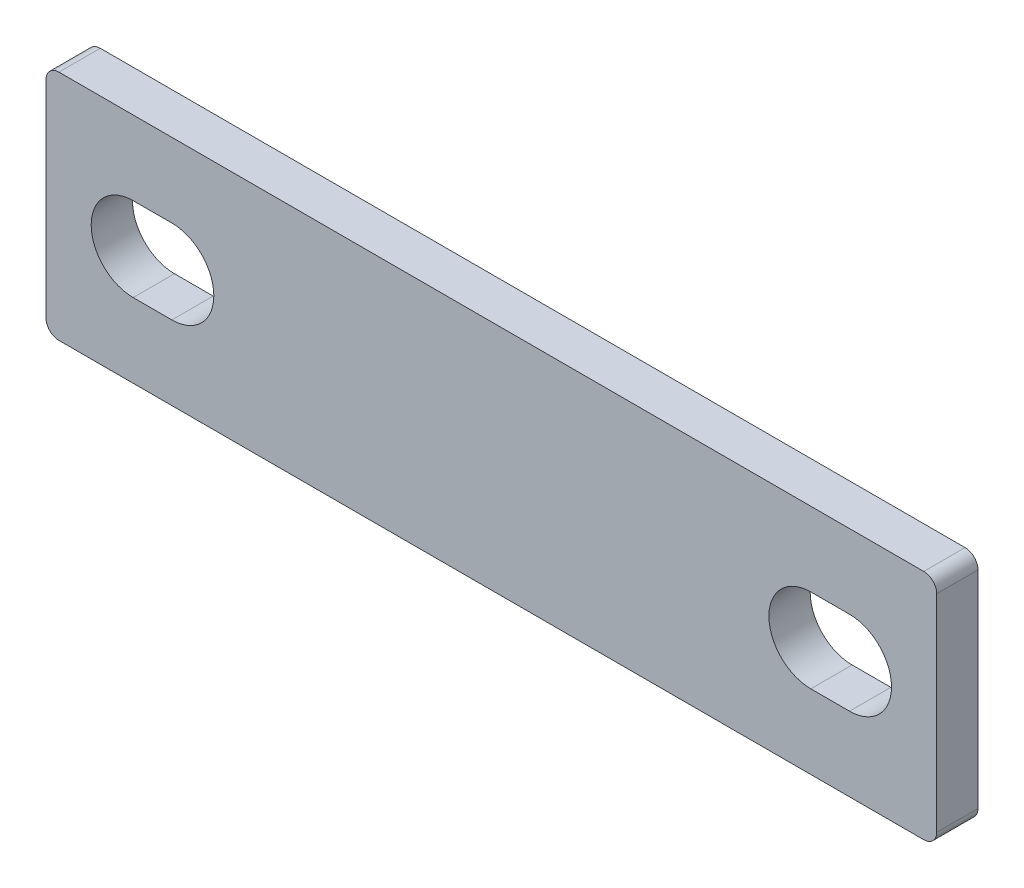
ISO-10303-21;
HEADER;
FILE_DESCRIPTION(('STEP AP214'),'2;1');
FILE_NAME('part.step','',(''),(''),'','','');
FILE_SCHEMA(('AUTOMOTIVE_DESIGN { 1 0 10303 214 1 1 1 1 }'));
ENDSEC;
DATA;
#1=APPLICATION_CONTEXT('core data for automotive mechanical design processes');
#2=APPLICATION_PROTOCOL_DEFINITION('international standard','automotive_design',2000,#1);
#3=PRODUCT_CONTEXT('',#1,'mechanical');
#4=PRODUCT('Part','Part','',(#3));
#5=PRODUCT_RELATED_PRODUCT_CATEGORY('part','',(#4));
#6=PRODUCT_DEFINITION_FORMATION('','',#4);
#7=PRODUCT_DEFINITION_CONTEXT('part definition',#1,'design');
#8=PRODUCT_DEFINITION('design','',#6,#7);
#9=PRODUCT_DEFINITION_SHAPE('','',#8);
#10=(LENGTH_UNIT() NAMED_UNIT(*) SI_UNIT(.MILLI.,.METRE.));
#11=(NAMED_UNIT(*) PLANE_ANGLE_UNIT() SI_UNIT($,.RADIAN.));
#12=(NAMED_UNIT(*) SI_UNIT($,.STERADIAN.) SOLID_ANGLE_UNIT());
#13=UNCERTAINTY_MEASURE_WITH_UNIT(LENGTH_MEASURE(1.E-05),#10,'distance_accuracy_value','');
#14=(GEOMETRIC_REPRESENTATION_CONTEXT(3) GLOBAL_UNCERTAINTY_ASSIGNED_CONTEXT((#13)) GLOBAL_UNIT_ASSIGNED_CONTEXT((#10,
#11,#12)) REPRESENTATION_CONTEXT('',''));
#15=CARTESIAN_POINT('',(0.,0.,0.));
#16=DIRECTION('',(0.,0.,1.));
#17=DIRECTION('',(1.,0.,0.));
#18=AXIS2_PLACEMENT_3D('',#15,#16,#17);
#19=CARTESIAN_POINT('',(-40.,-36.,149.018371888057));
#20=DIRECTION('',(0.,1.,0.));
#21=DIRECTION('',(0.,0.,1.));
#22=AXIS2_PLACEMENT_3D('',#19,#20,#21);
#23=PLANE('',#22);
#24=DIRECTION('',(1.,0.,0.));
#25=VECTOR('',#24,1.);
#26=CARTESIAN_POINT('',(-40.,-36.,6.40000000000004));
#27=LINE('',#26,#25);
#28=CARTESIAN_POINT('',(-136.,-36.,6.40000000000004));
#29=VERTEX_POINT('',#28);
#30=CARTESIAN_POINT('',(-2.,-36.,6.40000000000005));
#31=VERTEX_POINT('',#30);
#32=EDGE_CURVE('E305',#29,#31,#27,.T.);
#33=ORIENTED_EDGE('',*,*,#32,.F.);
#34=DIRECTION('',(0.,0.,-1.));
#35=VECTOR('',#34,1.);
#36=CARTESIAN_POINT('',(-136.,-36.,149.018371888057));
#37=LINE('',#36,#35);
#38=CARTESIAN_POINT('',(-136.,-36.,0.));
#39=VERTEX_POINT('',#38);
#40=EDGE_CURVE('E47',#29,#39,#37,.T.);
#41=ORIENTED_EDGE('',*,*,#40,.T.);
#42=DIRECTION('',(1.,0.,0.));
#43=VECTOR('',#42,1.);
#44=CARTESIAN_POINT('',(-40.,-36.,0.));
#45=LINE('',#44,#43);
#46=CARTESIAN_POINT('',(-2.,-36.,0.));
#47=VERTEX_POINT('',#46);
#48=EDGE_CURVE('E213',#39,#47,#45,.T.);
#49=ORIENTED_EDGE('',*,*,#48,.T.);
#50=DIRECTION('',(0.,0.,-1.));
#51=VECTOR('',#50,1.);
#52=CARTESIAN_POINT('',(-2.,-36.,149.018371888057));
#53=LINE('',#52,#51);
#54=EDGE_CURVE('E216',#31,#47,#53,.T.);
#55=ORIENTED_EDGE('',*,*,#54,.F.);
#56=EDGE_LOOP('',(#33,#41,#49,#55));
#57=FACE_BOUND('',#56,.T.);
#58=ADVANCED_FACE('F32',(#57),#23,.F.);
#59=CARTESIAN_POINT('',(-136.,-34.,149.018371888057));
#60=DIRECTION('',(0.,0.,-1.));
#61=DIRECTION('',(-1.,0.,0.));
#62=AXIS2_PLACEMENT_3D('',#59,#60,#61);
#63=CYLINDRICAL_SURFACE('',#62,2.);
#64=CARTESIAN_POINT('',(-136.,-34.,6.40000000000004));
#65=DIRECTION('',(0.,0.,1.));
#66=DIRECTION('',(0.,-1.,0.));
#67=AXIS2_PLACEMENT_3D('',#64,#65,#66);
#68=CIRCLE('',#67,2.);
#69=CARTESIAN_POINT('',(-138.,-34.,6.40000000000004));
#70=VERTEX_POINT('',#69);
#71=EDGE_CURVE('E253',#70,#29,#68,.T.);
#72=ORIENTED_EDGE('',*,*,#71,.F.);
#73=DIRECTION('',(0.,0.,-1.));
#74=VECTOR('',#73,1.);
#75=CARTESIAN_POINT('',(-138.,-34.,149.018371888057));
#76=LINE('',#75,#74);
#77=CARTESIAN_POINT('',(-138.,-34.,0.));
#78=VERTEX_POINT('',#77);
#79=EDGE_CURVE('E219',#70,#78,#76,.T.);
#80=ORIENTED_EDGE('',*,*,#79,.T.);
#81=CARTESIAN_POINT('',(-136.,-34.,0.));
#82=DIRECTION('',(0.,0.,1.));
#83=DIRECTION('',(1.,0.,0.));
#84=AXIS2_PLACEMENT_3D('',#81,#82,#83);
#85=CIRCLE('',#84,2.);
#86=EDGE_CURVE('E211',#78,#39,#85,.T.);
#87=ORIENTED_EDGE('',*,*,#86,.T.);
#88=ORIENTED_EDGE('',*,*,#40,.F.);
#89=EDGE_LOOP('',(#72,#80,#87,#88));
#90=FACE_BOUND('',#89,.T.);
#91=ADVANCED_FACE('F250',(#90),#63,.T.);
#92=CARTESIAN_POINT('',(-138.,-2.,149.018371888057));
#93=DIRECTION('',(1.,0.,0.));
#94=DIRECTION('',(0.,0.,-1.));
#95=AXIS2_PLACEMENT_3D('',#92,#93,#94);
#96=PLANE('',#95);
#97=DIRECTION('',(0.,-1.,0.));
#98=VECTOR('',#97,1.);
#99=CARTESIAN_POINT('',(-138.,-1.99999999999998,6.40000000000004));
#100=LINE('',#99,#98);
#101=CARTESIAN_POINT('',(-138.,-2.,6.40000000000004));
#102=VERTEX_POINT('',#101);
#103=EDGE_CURVE('E308',#102,#70,#100,.T.);
#104=ORIENTED_EDGE('',*,*,#103,.F.);
#105=DIRECTION('',(0.,0.,-1.));
#106=VECTOR('',#105,1.);
#107=CARTESIAN_POINT('',(-138.,-2.,149.018371888057));
#108=LINE('',#107,#106);
#109=CARTESIAN_POINT('',(-138.,-2.,0.));
#110=VERTEX_POINT('',#109);
#111=EDGE_CURVE('E221',#102,#110,#108,.T.);
#112=ORIENTED_EDGE('',*,*,#111,.T.);
#113=DIRECTION('',(0.,-1.,0.));
#114=VECTOR('',#113,1.);
#115=CARTESIAN_POINT('',(-138.,-2.,0.));
#116=LINE('',#115,#114);
#117=EDGE_CURVE('E208',#110,#78,#116,.T.);
#118=ORIENTED_EDGE('',*,*,#117,.T.);
#119=ORIENTED_EDGE('',*,*,#79,.F.);
#120=EDGE_LOOP('',(#104,#112,#118,#119));
#121=FACE_BOUND('',#120,.T.);
#122=ADVANCED_FACE('F256',(#121),#96,.F.);
#123=CARTESIAN_POINT('',(-136.,-2.,149.018371888057));
#124=DIRECTION('',(0.,0.,-1.));
#125=DIRECTION('',(-1.,0.,0.));
#126=AXIS2_PLACEMENT_3D('',#123,#124,#125);
#127=CYLINDRICAL_SURFACE('',#126,2.);
#128=CARTESIAN_POINT('',(-136.,-2.,6.40000000000004));
#129=DIRECTION('',(0.,0.,1.));
#130=DIRECTION('',(0.,-1.,0.));
#131=AXIS2_PLACEMENT_3D('',#128,#129,#130);
#132=CIRCLE('',#131,2.);
#133=CARTESIAN_POINT('',(-136.,0.,6.40000000000004));
#134=VERTEX_POINT('',#133);
#135=EDGE_CURVE('E263',#134,#102,#132,.T.);
#136=ORIENTED_EDGE('',*,*,#135,.F.);
#137=DIRECTION('',(0.,0.,-1.));
#138=VECTOR('',#137,1.);
#139=CARTESIAN_POINT('',(-136.,0.,149.018371888057));
#140=LINE('',#139,#138);
#141=CARTESIAN_POINT('',(-136.,0.,0.));
#142=VERTEX_POINT('',#141);
#143=EDGE_CURVE('E223',#134,#142,#140,.T.);
#144=ORIENTED_EDGE('',*,*,#143,.T.);
#145=CARTESIAN_POINT('',(-136.,-2.,0.));
#146=DIRECTION('',(0.,0.,1.));
#147=DIRECTION('',(1.,0.,0.));
#148=AXIS2_PLACEMENT_3D('',#145,#146,#147);
#149=CIRCLE('',#148,2.);
#150=EDGE_CURVE('E205',#142,#110,#149,.T.);
#151=ORIENTED_EDGE('',*,*,#150,.T.);
#152=ORIENTED_EDGE('',*,*,#111,.F.);
#153=EDGE_LOOP('',(#136,#144,#151,#152));
#154=FACE_BOUND('',#153,.T.);
#155=ADVANCED_FACE('F260',(#154),#127,.T.);
#156=CARTESIAN_POINT('',(-98.,0.,149.018371888057));
#157=DIRECTION('',(0.,-1.,0.));
#158=DIRECTION('',(0.,0.,-1.));
#159=AXIS2_PLACEMENT_3D('',#156,#157,#158);
#160=PLANE('',#159);
#161=DIRECTION('',(-1.,0.,0.));
#162=VECTOR('',#161,1.);
#163=CARTESIAN_POINT('',(-98.,0.,6.40000000000007));
#164=LINE('',#163,#162);
#165=CARTESIAN_POINT('',(-2.,0.,6.40000000000007));
#166=VERTEX_POINT('',#165);
#167=EDGE_CURVE('E268',#166,#134,#164,.T.);
#168=ORIENTED_EDGE('',*,*,#167,.F.);
#169=DIRECTION('',(0.,0.,-1.));
#170=VECTOR('',#169,1.);
#171=CARTESIAN_POINT('',(-2.,0.,149.018371888057));
#172=LINE('',#171,#170);
#173=CARTESIAN_POINT('',(-2.,0.,0.));
#174=VERTEX_POINT('',#173);
#175=EDGE_CURVE('E225',#166,#174,#172,.T.);
#176=ORIENTED_EDGE('',*,*,#175,.T.);
#177=DIRECTION('',(-1.,0.,0.));
#178=VECTOR('',#177,1.);
#179=CARTESIAN_POINT('',(-98.,0.,0.));
#180=LINE('',#179,#178);
#181=EDGE_CURVE('E202',#174,#142,#180,.T.);
#182=ORIENTED_EDGE('',*,*,#181,.T.);
#183=ORIENTED_EDGE('',*,*,#143,.F.);
#184=EDGE_LOOP('',(#168,#176,#182,#183));
#185=FACE_BOUND('',#184,.T.);
#186=ADVANCED_FACE('F266',(#185),#160,.F.);
#187=CARTESIAN_POINT('',(-2.,-2.,149.018371888057));
#188=DIRECTION('',(0.,0.,-1.));
#189=DIRECTION('',(-1.,0.,0.));
#190=AXIS2_PLACEMENT_3D('',#187,#188,#189);
#191=CYLINDRICAL_SURFACE('',#190,2.);
#192=CARTESIAN_POINT('',(-2.,-2.,6.40000000000007));
#193=DIRECTION('',(0.,0.,1.));
#194=DIRECTION('',(0.,-1.,0.));
#195=AXIS2_PLACEMENT_3D('',#192,#193,#194);
#196=CIRCLE('',#195,2.);
#197=CARTESIAN_POINT('',(0.,-2.,6.40000000000007));
#198=VERTEX_POINT('',#197);
#199=EDGE_CURVE('E272',#198,#166,#196,.T.);
#200=ORIENTED_EDGE('',*,*,#199,.F.);
#201=DIRECTION('',(0.,0.,-1.));
#202=VECTOR('',#201,1.);
#203=CARTESIAN_POINT('',(0.,-2.,149.018371888057));
#204=LINE('',#203,#202);
#205=CARTESIAN_POINT('',(0.,-2.,0.));
#206=VERTEX_POINT('',#205);
#207=EDGE_CURVE('E227',#198,#206,#204,.T.);
#208=ORIENTED_EDGE('',*,*,#207,.T.);
#209=CARTESIAN_POINT('',(-2.,-2.,0.));
#210=DIRECTION('',(0.,0.,1.));
#211=DIRECTION('',(1.,0.,0.));
#212=AXIS2_PLACEMENT_3D('',#209,#210,#211);
#213=CIRCLE('',#212,2.);
#214=EDGE_CURVE('E199',#206,#174,#213,.T.);
#215=ORIENTED_EDGE('',*,*,#214,.T.);
#216=ORIENTED_EDGE('',*,*,#175,.F.);
#217=EDGE_LOOP('',(#200,#208,#215,#216));
#218=FACE_BOUND('',#217,.T.);
#219=ADVANCED_FACE('F271',(#218),#191,.T.);
#220=CARTESIAN_POINT('',(0.,-34.,149.018371888057));
#221=DIRECTION('',(-1.,0.,0.));
#222=DIRECTION('',(0.,-1.,0.));
#223=AXIS2_PLACEMENT_3D('',#220,#221,#222);
#224=PLANE('',#223);
#225=DIRECTION('',(0.,1.,0.));
#226=VECTOR('',#225,1.);
#227=CARTESIAN_POINT('',(0.,-34.,6.40000000000007));
#228=LINE('',#227,#226);
#229=CARTESIAN_POINT('',(0.,-34.,6.40000000000007));
#230=VERTEX_POINT('',#229);
#231=EDGE_CURVE('E235',#230,#198,#228,.T.);
#232=ORIENTED_EDGE('',*,*,#231,.F.);
#233=DIRECTION('',(0.,0.,-1.));
#234=VECTOR('',#233,1.);
#235=CARTESIAN_POINT('',(0.,-34.,149.018371888057));
#236=LINE('',#235,#234);
#237=CARTESIAN_POINT('',(0.,-34.,0.));
#238=VERTEX_POINT('',#237);
#239=EDGE_CURVE('E40',#230,#238,#236,.T.);
#240=ORIENTED_EDGE('',*,*,#239,.T.);
#241=DIRECTION('',(0.,1.,0.));
#242=VECTOR('',#241,1.);
#243=CARTESIAN_POINT('',(0.,-34.,0.));
#244=LINE('',#243,#242);
#245=EDGE_CURVE('E196',#238,#206,#244,.T.);
#246=ORIENTED_EDGE('',*,*,#245,.T.);
#247=ORIENTED_EDGE('',*,*,#207,.F.);
#248=EDGE_LOOP('',(#232,#240,#246,#247));
#249=FACE_BOUND('',#248,.T.);
#250=ADVANCED_FACE('F231',(#249),#224,.F.);
#251=CARTESIAN_POINT('',(-2.,-34.,149.018371888057));
#252=DIRECTION('',(0.,0.,-1.));
#253=DIRECTION('',(-1.,0.,0.));
#254=AXIS2_PLACEMENT_3D('',#251,#252,#253);
#255=CYLINDRICAL_SURFACE('',#254,2.);
#256=CARTESIAN_POINT('',(-2.,-34.,6.40000000000007));
#257=DIRECTION('',(0.,0.,1.));
#258=DIRECTION('',(0.,-1.,0.));
#259=AXIS2_PLACEMENT_3D('',#256,#257,#258);
#260=CIRCLE('',#259,2.);
#261=EDGE_CURVE('E245',#31,#230,#260,.T.);
#262=ORIENTED_EDGE('',*,*,#261,.F.);
#263=ORIENTED_EDGE('',*,*,#54,.T.);
#264=CARTESIAN_POINT('',(-2.,-34.,0.));
#265=DIRECTION('',(0.,0.,1.));
#266=DIRECTION('',(1.,0.,0.));
#267=AXIS2_PLACEMENT_3D('',#264,#265,#266);
#268=CIRCLE('',#267,2.);
#269=EDGE_CURVE('E193',#47,#238,#268,.T.);
#270=ORIENTED_EDGE('',*,*,#269,.T.);
#271=ORIENTED_EDGE('',*,*,#239,.F.);
#272=EDGE_LOOP('',(#262,#263,#270,#271));
#273=FACE_BOUND('',#272,.T.);
#274=ADVANCED_FACE('F34',(#273),#255,.T.);
#275=CARTESIAN_POINT('',(-13.5,-11.5,149.018371888057));
#276=DIRECTION('',(0.,-1.,0.));
#277=DIRECTION('',(0.,0.,-1.));
#278=AXIS2_PLACEMENT_3D('',#275,#276,#277);
#279=PLANE('',#278);
#280=DIRECTION('',(0.,0.,-1.));
#281=VECTOR('',#280,1.);
#282=CARTESIAN_POINT('',(-13.5,-11.5,149.018371888057));
#283=LINE('',#282,#281);
#284=CARTESIAN_POINT('',(-13.5,-11.5,6.40000000000007));
#285=VERTEX_POINT('',#284);
#286=CARTESIAN_POINT('',(-13.5,-11.5,0.));
#287=VERTEX_POINT('',#286);
#288=EDGE_CURVE('E187',#285,#287,#283,.T.);
#289=ORIENTED_EDGE('',*,*,#288,.F.);
#290=DIRECTION('',(-1.,0.,0.));
#291=VECTOR('',#290,1.);
#292=CARTESIAN_POINT('',(-13.5,-11.5,6.40000000000007));
#293=LINE('',#292,#291);
#294=CARTESIAN_POINT('',(-19.5,-11.5,6.40000000000007));
#295=VERTEX_POINT('',#294);
#296=EDGE_CURVE('E293',#285,#295,#293,.T.);
#297=ORIENTED_EDGE('',*,*,#296,.T.);
#298=DIRECTION('',(0.,0.,-1.));
#299=VECTOR('',#298,1.);
#300=CARTESIAN_POINT('',(-19.5,-11.5,149.018371888057));
#301=LINE('',#300,#299);
#302=CARTESIAN_POINT('',(-19.5,-11.5,0.));
#303=VERTEX_POINT('',#302);
#304=EDGE_CURVE('E185',#295,#303,#301,.T.);
#305=ORIENTED_EDGE('',*,*,#304,.T.);
#306=DIRECTION('',(-1.,0.,0.));
#307=VECTOR('',#306,1.);
#308=CARTESIAN_POINT('',(-13.5,-11.5,0.));
#309=LINE('',#308,#307);
#310=EDGE_CURVE('E182',#287,#303,#309,.T.);
#311=ORIENTED_EDGE('',*,*,#310,.F.);
#312=EDGE_LOOP('',(#289,#297,#305,#311));
#313=FACE_BOUND('',#312,.T.);
#314=ADVANCED_FACE('F317',(#313),#279,.T.);
#315=CARTESIAN_POINT('',(-13.5,-18.,149.018371888057));
#316=DIRECTION('',(0.,0.,-1.));
#317=DIRECTION('',(-1.,0.,0.));
#318=AXIS2_PLACEMENT_3D('',#315,#316,#317);
#319=CYLINDRICAL_SURFACE('',#318,6.5);
#320=DIRECTION('',(0.,0.,-1.));
#321=VECTOR('',#320,1.);
#322=CARTESIAN_POINT('',(-13.5,-24.5,149.018371888057));
#323=LINE('',#322,#321);
#324=CARTESIAN_POINT('',(-13.5,-24.5,6.40000000000007));
#325=VERTEX_POINT('',#324);
#326=CARTESIAN_POINT('',(-13.5,-24.5,0.));
#327=VERTEX_POINT('',#326);
#328=EDGE_CURVE('E189',#325,#327,#323,.T.);
#329=ORIENTED_EDGE('',*,*,#328,.F.);
#330=CARTESIAN_POINT('',(-13.5,-18.,6.40000000000007));
#331=DIRECTION('',(0.,0.,1.));
#332=DIRECTION('',(0.,-1.,0.));
#333=AXIS2_PLACEMENT_3D('',#330,#331,#332);
#334=CIRCLE('',#333,6.5);
#335=EDGE_CURVE('E298',#325,#285,#334,.T.);
#336=ORIENTED_EDGE('',*,*,#335,.T.);
#337=ORIENTED_EDGE('',*,*,#288,.T.);
#338=CARTESIAN_POINT('',(-13.5,-18.,0.));
#339=DIRECTION('',(0.,0.,1.));
#340=DIRECTION('',(1.,0.,0.));
#341=AXIS2_PLACEMENT_3D('',#338,#339,#340);
#342=CIRCLE('',#341,6.5);
#343=EDGE_CURVE('E179',#327,#287,#342,.T.);
#344=ORIENTED_EDGE('',*,*,#343,.F.);
#345=EDGE_LOOP('',(#329,#336,#337,#344));
#346=FACE_BOUND('',#345,.T.);
#347=ADVANCED_FACE('F320',(#346),#319,.F.);
#348=CARTESIAN_POINT('',(-19.5,-24.5,149.018371888057));
#349=DIRECTION('',(0.,1.,0.));
#350=DIRECTION('',(0.,0.,1.));
#351=AXIS2_PLACEMENT_3D('',#348,#349,#350);
#352=PLANE('',#351);
#353=DIRECTION('',(0.,0.,-1.));
#354=VECTOR('',#353,1.);
#355=CARTESIAN_POINT('',(-19.5,-24.5,149.018371888057));
#356=LINE('',#355,#354);
#357=CARTESIAN_POINT('',(-19.5,-24.5,6.40000000000007));
#358=VERTEX_POINT('',#357);
#359=CARTESIAN_POINT('',(-19.5,-24.5,0.));
#360=VERTEX_POINT('',#359);
#361=EDGE_CURVE('E191',#358,#360,#356,.T.);
#362=ORIENTED_EDGE('',*,*,#361,.F.);
#363=DIRECTION('',(1.,0.,0.));
#364=VECTOR('',#363,1.);
#365=CARTESIAN_POINT('',(-19.5,-24.5,6.40000000000007));
#366=LINE('',#365,#364);
#367=EDGE_CURVE('E301',#358,#325,#366,.T.);
#368=ORIENTED_EDGE('',*,*,#367,.T.);
#369=ORIENTED_EDGE('',*,*,#328,.T.);
#370=DIRECTION('',(1.,0.,0.));
#371=VECTOR('',#370,1.);
#372=CARTESIAN_POINT('',(-19.5,-24.5,0.));
#373=LINE('',#372,#371);
#374=EDGE_CURVE('E176',#360,#327,#373,.T.);
#375=ORIENTED_EDGE('',*,*,#374,.F.);
#376=EDGE_LOOP('',(#362,#368,#369,#375));
#377=FACE_BOUND('',#376,.T.);
#378=ADVANCED_FACE('F323',(#377),#352,.T.);
#379=CARTESIAN_POINT('',(-19.5,-18.,149.018371888057));
#380=DIRECTION('',(0.,0.,-1.));
#381=DIRECTION('',(-1.,0.,0.));
#382=AXIS2_PLACEMENT_3D('',#379,#380,#381);
#383=CYLINDRICAL_SURFACE('',#382,6.5);
#384=ORIENTED_EDGE('',*,*,#304,.F.);
#385=CARTESIAN_POINT('',(-19.5,-18.,6.40000000000007));
#386=DIRECTION('',(0.,0.,1.));
#387=DIRECTION('',(0.,-1.,0.));
#388=AXIS2_PLACEMENT_3D('',#385,#386,#387);
#389=CIRCLE('',#388,6.5);
#390=EDGE_CURVE('E55',#295,#358,#389,.T.);
#391=ORIENTED_EDGE('',*,*,#390,.T.);
#392=ORIENTED_EDGE('',*,*,#361,.T.);
#393=CARTESIAN_POINT('',(-19.5,-18.,0.));
#394=DIRECTION('',(0.,0.,1.));
#395=DIRECTION('',(1.,0.,0.));
#396=AXIS2_PLACEMENT_3D('',#393,#394,#395);
#397=CIRCLE('',#396,6.5);
#398=EDGE_CURVE('E173',#303,#360,#397,.T.);
#399=ORIENTED_EDGE('',*,*,#398,.F.);
#400=EDGE_LOOP('',(#384,#391,#392,#399));
#401=FACE_BOUND('',#400,.T.);
#402=ADVANCED_FACE('F310',(#401),#383,.F.);
#403=CARTESIAN_POINT('',(-2.,-34.,0.));
#404=DIRECTION('',(0.,0.,1.));
#405=DIRECTION('',(1.,0.,0.));
#406=AXIS2_PLACEMENT_3D('',#403,#404,#405);
#407=PLANE('',#406);
#408=ORIENTED_EDGE('',*,*,#398,.T.);
#409=ORIENTED_EDGE('',*,*,#374,.T.);
#410=ORIENTED_EDGE('',*,*,#343,.T.);
#411=ORIENTED_EDGE('',*,*,#310,.T.);
#412=EDGE_LOOP('',(#408,#409,#410,#411));
#413=FACE_BOUND('',#412,.T.);
#414=ORIENTED_EDGE('',*,*,#269,.F.);
#415=ORIENTED_EDGE('',*,*,#48,.F.);
#416=ORIENTED_EDGE('',*,*,#86,.F.);
#417=ORIENTED_EDGE('',*,*,#117,.F.);
#418=ORIENTED_EDGE('',*,*,#150,.F.);
#419=ORIENTED_EDGE('',*,*,#181,.F.);
#420=ORIENTED_EDGE('',*,*,#214,.F.);
#421=ORIENTED_EDGE('',*,*,#245,.F.);
#422=EDGE_LOOP('',(#414,#415,#416,#417,#418,#419,#420,#421));
#423=FACE_BOUND('',#422,.T.);
#424=CARTESIAN_POINT('',(-124.5,-18.,0.));
#425=DIRECTION('',(0.,0.,1.));
#426=DIRECTION('',(1.,0.,0.));
#427=AXIS2_PLACEMENT_3D('',#424,#425,#426);
#428=CIRCLE('',#427,6.49999999999999);
#429=CARTESIAN_POINT('',(-124.5,-11.5,0.));
#430=VERTEX_POINT('',#429);
#431=CARTESIAN_POINT('',(-124.5,-24.5,0.));
#432=VERTEX_POINT('',#431);
#433=EDGE_CURVE('E280',#430,#432,#428,.T.);
#434=ORIENTED_EDGE('',*,*,#433,.T.);
#435=DIRECTION('',(1.,0.,0.));
#436=VECTOR('',#435,1.);
#437=CARTESIAN_POINT('',(-124.5,-24.5,0.));
#438=LINE('',#437,#436);
#439=CARTESIAN_POINT('',(-118.5,-24.5,0.));
#440=VERTEX_POINT('',#439);
#441=EDGE_CURVE('E283',#432,#440,#438,.T.);
#442=ORIENTED_EDGE('',*,*,#441,.T.);
#443=CARTESIAN_POINT('',(-118.5,-18.,0.));
#444=DIRECTION('',(0.,0.,1.));
#445=DIRECTION('',(1.,0.,0.));
#446=AXIS2_PLACEMENT_3D('',#443,#444,#445);
#447=CIRCLE('',#446,6.49999999999999);
#448=CARTESIAN_POINT('',(-118.5,-11.5,0.));
#449=VERTEX_POINT('',#448);
#450=EDGE_CURVE('E286',#440,#449,#447,.T.);
#451=ORIENTED_EDGE('',*,*,#450,.T.);
#452=DIRECTION('',(-1.,0.,0.));
#453=VECTOR('',#452,1.);
#454=CARTESIAN_POINT('',(-118.5,-11.5,0.));
#455=LINE('',#454,#453);
#456=EDGE_CURVE('E163',#449,#430,#455,.T.);
#457=ORIENTED_EDGE('',*,*,#456,.T.);
#458=EDGE_LOOP('',(#434,#442,#451,#457));
#459=FACE_BOUND('',#458,.T.);
#460=ADVANCED_FACE('F241',(#413,#423,#459),#407,.F.);
#461=CARTESIAN_POINT('',(-118.5,-11.5,149.018371888057));
#462=DIRECTION('',(0.,-1.,0.));
#463=DIRECTION('',(1.,0.,0.));
#464=AXIS2_PLACEMENT_3D('',#461,#462,#463);
#465=PLANE('',#464);
#466=DIRECTION('',(0.,0.,-1.));
#467=VECTOR('',#466,1.);
#468=CARTESIAN_POINT('',(-118.5,-11.5,149.018371888057));
#469=LINE('',#468,#467);
#470=CARTESIAN_POINT('',(-118.5,-11.5,6.40000000000004));
#471=VERTEX_POINT('',#470);
#472=EDGE_CURVE('E155',#471,#449,#469,.T.);
#473=ORIENTED_EDGE('',*,*,#472,.F.);
#474=DIRECTION('',(-1.,0.,0.));
#475=VECTOR('',#474,1.);
#476=CARTESIAN_POINT('',(-118.5,-11.5,6.40000000000004));
#477=LINE('',#476,#475);
#478=CARTESIAN_POINT('',(-124.5,-11.5,6.40000000000004));
#479=VERTEX_POINT('',#478);
#480=EDGE_CURVE('E11',#471,#479,#477,.T.);
#481=ORIENTED_EDGE('',*,*,#480,.T.);
#482=DIRECTION('',(0.,0.,-1.));
#483=VECTOR('',#482,1.);
#484=CARTESIAN_POINT('',(-124.5,-11.5,149.018371888057));
#485=LINE('',#484,#483);
#486=EDGE_CURVE('E165',#479,#430,#485,.T.);
#487=ORIENTED_EDGE('',*,*,#486,.T.);
#488=ORIENTED_EDGE('',*,*,#456,.F.);
#489=EDGE_LOOP('',(#473,#481,#487,#488));
#490=FACE_BOUND('',#489,.T.);
#491=ADVANCED_FACE('F161',(#490),#465,.T.);
#492=CARTESIAN_POINT('',(-118.5,-18.,149.018371888057));
#493=DIRECTION('',(0.,0.,-1.));
#494=DIRECTION('',(-1.,0.,0.));
#495=AXIS2_PLACEMENT_3D('',#492,#493,#494);
#496=CYLINDRICAL_SURFACE('',#495,6.49999999999999);
#497=DIRECTION('',(0.,0.,-1.));
#498=VECTOR('',#497,1.);
#499=CARTESIAN_POINT('',(-118.5,-24.5,149.018371888057));
#500=LINE('',#499,#498);
#501=CARTESIAN_POINT('',(-118.5,-24.5,6.40000000000004));
#502=VERTEX_POINT('',#501);
#503=EDGE_CURVE('E157',#502,#440,#500,.T.);
#504=ORIENTED_EDGE('',*,*,#503,.F.);
#505=CARTESIAN_POINT('',(-118.5,-18.,6.40000000000004));
#506=DIRECTION('',(0.,0.,1.));
#507=DIRECTION('',(0.,-1.,0.));
#508=AXIS2_PLACEMENT_3D('',#505,#506,#507);
#509=CIRCLE('',#508,6.49999999999999);
#510=EDGE_CURVE('E145',#502,#471,#509,.T.);
#511=ORIENTED_EDGE('',*,*,#510,.T.);
#512=ORIENTED_EDGE('',*,*,#472,.T.);
#513=ORIENTED_EDGE('',*,*,#450,.F.);
#514=EDGE_LOOP('',(#504,#511,#512,#513));
#515=FACE_BOUND('',#514,.T.);
#516=ADVANCED_FACE('F153',(#515),#496,.F.);
#517=CARTESIAN_POINT('',(-124.5,-24.5,149.018371888057));
#518=DIRECTION('',(0.,1.,0.));
#519=DIRECTION('',(-1.,0.,0.));
#520=AXIS2_PLACEMENT_3D('',#517,#518,#519);
#521=PLANE('',#520);
#522=DIRECTION('',(0.,0.,-1.));
#523=VECTOR('',#522,1.);
#524=CARTESIAN_POINT('',(-124.5,-24.5,149.018371888057));
#525=LINE('',#524,#523);
#526=CARTESIAN_POINT('',(-124.5,-24.5,6.40000000000004));
#527=VERTEX_POINT('',#526);
#528=EDGE_CURVE('E167',#527,#432,#525,.T.);
#529=ORIENTED_EDGE('',*,*,#528,.F.);
#530=DIRECTION('',(1.,0.,0.));
#531=VECTOR('',#530,1.);
#532=CARTESIAN_POINT('',(-124.5,-24.5,6.40000000000004));
#533=LINE('',#532,#531);
#534=EDGE_CURVE('E159',#527,#502,#533,.T.);
#535=ORIENTED_EDGE('',*,*,#534,.T.);
#536=ORIENTED_EDGE('',*,*,#503,.T.);
#537=ORIENTED_EDGE('',*,*,#441,.F.);
#538=EDGE_LOOP('',(#529,#535,#536,#537));
#539=FACE_BOUND('',#538,.T.);
#540=ADVANCED_FACE('F291',(#539),#521,.T.);
#541=CARTESIAN_POINT('',(-124.5,-18.,149.018371888057));
#542=DIRECTION('',(0.,0.,-1.));
#543=DIRECTION('',(-1.,0.,0.));
#544=AXIS2_PLACEMENT_3D('',#541,#542,#543);
#545=CYLINDRICAL_SURFACE('',#544,6.49999999999999);
#546=ORIENTED_EDGE('',*,*,#486,.F.);
#547=CARTESIAN_POINT('',(-124.5,-18.,6.40000000000004));
#548=DIRECTION('',(0.,0.,1.));
#549=DIRECTION('',(0.,-1.,0.));
#550=AXIS2_PLACEMENT_3D('',#547,#548,#549);
#551=CIRCLE('',#550,6.49999999999999);
#552=EDGE_CURVE('E148',#479,#527,#551,.T.);
#553=ORIENTED_EDGE('',*,*,#552,.T.);
#554=ORIENTED_EDGE('',*,*,#528,.T.);
#555=ORIENTED_EDGE('',*,*,#433,.F.);
#556=EDGE_LOOP('',(#546,#553,#554,#555));
#557=FACE_BOUND('',#556,.T.);
#558=ADVANCED_FACE('F360',(#557),#545,.F.);
#559=CARTESIAN_POINT('',(-101.,-103.,6.40000000000006));
#560=DIRECTION('',(0.,0.,1.));
#561=DIRECTION('',(0.,1.,0.));
#562=AXIS2_PLACEMENT_3D('',#559,#560,#561);
#563=PLANE('',#562);
#564=ORIENTED_EDGE('',*,*,#552,.F.);
#565=ORIENTED_EDGE('',*,*,#480,.F.);
#566=ORIENTED_EDGE('',*,*,#510,.F.);
#567=ORIENTED_EDGE('',*,*,#534,.F.);
#568=EDGE_LOOP('',(#564,#565,#566,#567));
#569=FACE_BOUND('',#568,.T.);
#570=ORIENTED_EDGE('',*,*,#390,.F.);
#571=ORIENTED_EDGE('',*,*,#296,.F.);
#572=ORIENTED_EDGE('',*,*,#335,.F.);
#573=ORIENTED_EDGE('',*,*,#367,.F.);
#574=EDGE_LOOP('',(#570,#571,#572,#573));
#575=FACE_BOUND('',#574,.T.);
#576=ORIENTED_EDGE('',*,*,#32,.T.);
#577=ORIENTED_EDGE('',*,*,#261,.T.);
#578=ORIENTED_EDGE('',*,*,#231,.T.);
#579=ORIENTED_EDGE('',*,*,#199,.T.);
#580=ORIENTED_EDGE('',*,*,#167,.T.);
#581=ORIENTED_EDGE('',*,*,#135,.T.);
#582=ORIENTED_EDGE('',*,*,#103,.T.);
#583=ORIENTED_EDGE('',*,*,#71,.T.);
#584=EDGE_LOOP('',(#576,#577,#578,#579,#580,#581,#582,#583));
#585=FACE_BOUND('',#584,.T.);
#586=ADVANCED_FACE('F144',(#569,#575,#585),#563,.T.);
#587=CLOSED_SHELL('',(#58,#91,#122,#155,#186,#219,#250,#274,#314,#347,#378,#402,#460,#491,#516,
#540,#558,#586));
#588=MANIFOLD_SOLID_BREP('B2',#587);
#589=ADVANCED_BREP_SHAPE_REPRESENTATION('',(#18,#588),#14);
#590=SHAPE_DEFINITION_REPRESENTATION(#9,#589);
ENDSEC;
END-ISO-10303-21;
